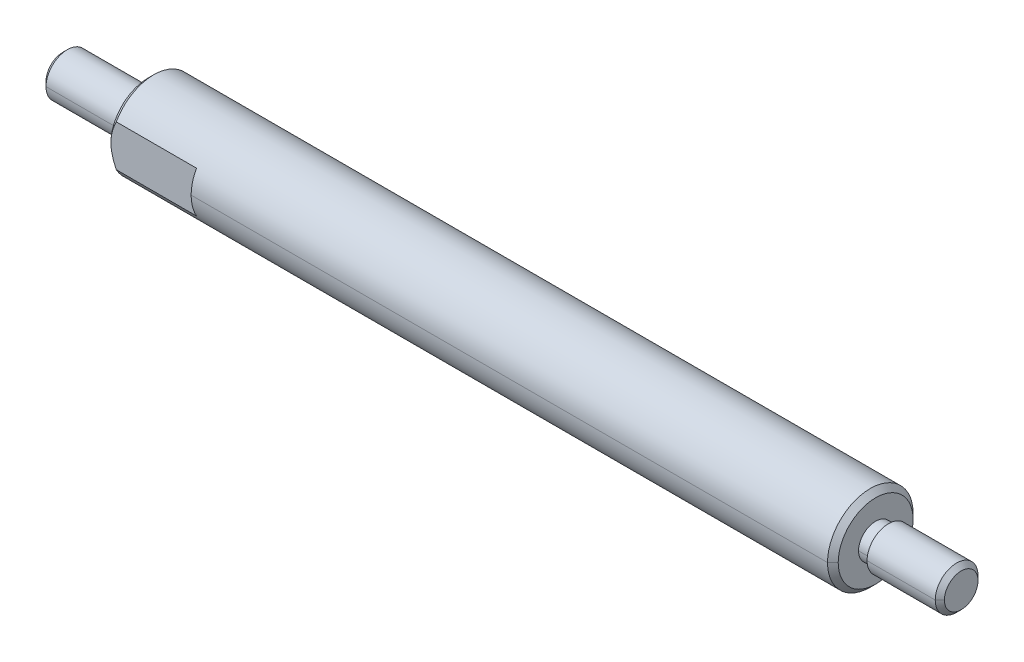
ISO-10303-21;
HEADER;
FILE_DESCRIPTION(('STEP AP214'),'2;1');
FILE_NAME('part.step','',(''),(''),'','','');
FILE_SCHEMA(('AUTOMOTIVE_DESIGN { 1 0 10303 214 1 1 1 1 }'));
ENDSEC;
DATA;
#1=APPLICATION_CONTEXT('core data for automotive mechanical design processes');
#2=APPLICATION_PROTOCOL_DEFINITION('international standard','automotive_design',2000,#1);
#3=PRODUCT_CONTEXT('',#1,'mechanical');
#4=PRODUCT('Part','Part','',(#3));
#5=PRODUCT_RELATED_PRODUCT_CATEGORY('part','',(#4));
#6=PRODUCT_DEFINITION_FORMATION('','',#4);
#7=PRODUCT_DEFINITION_CONTEXT('part definition',#1,'design');
#8=PRODUCT_DEFINITION('design','',#6,#7);
#9=PRODUCT_DEFINITION_SHAPE('','',#8);
#10=(LENGTH_UNIT() NAMED_UNIT(*) SI_UNIT(.MILLI.,.METRE.));
#11=(NAMED_UNIT(*) PLANE_ANGLE_UNIT() SI_UNIT($,.RADIAN.));
#12=(NAMED_UNIT(*) SI_UNIT($,.STERADIAN.) SOLID_ANGLE_UNIT());
#13=UNCERTAINTY_MEASURE_WITH_UNIT(LENGTH_MEASURE(1.E-05),#10,'distance_accuracy_value','');
#14=(GEOMETRIC_REPRESENTATION_CONTEXT(3) GLOBAL_UNCERTAINTY_ASSIGNED_CONTEXT((#13)) GLOBAL_UNIT_ASSIGNED_CONTEXT((#10,
#11,#12)) REPRESENTATION_CONTEXT('',''));
#15=CARTESIAN_POINT('',(0.,0.,0.));
#16=DIRECTION('',(0.,0.,1.));
#17=DIRECTION('',(1.,0.,0.));
#18=AXIS2_PLACEMENT_3D('',#15,#16,#17);
#19=CARTESIAN_POINT('',(0.,0.,0.));
#20=DIRECTION('',(1.,0.,0.));
#21=DIRECTION('',(0.,1.,0.));
#22=AXIS2_PLACEMENT_3D('',#19,#20,#21);
#23=CONICAL_SURFACE('',#22,3.5,0.785398163397448);
#24=CARTESIAN_POINT('',(0.5,0.,0.));
#25=DIRECTION('',(1.,0.,0.));
#26=DIRECTION('',(0.,0.,-1.));
#27=AXIS2_PLACEMENT_3D('',#24,#25,#26);
#28=CIRCLE('',#27,4.);
#29=CARTESIAN_POINT('',(0.5,-1.93649167310371,3.5));
#30=VERTEX_POINT('',#29);
#31=CARTESIAN_POINT('',(0.5,-1.93649167310371,-3.5));
#32=VERTEX_POINT('',#31);
#33=EDGE_CURVE('E11',#30,#32,#28,.T.);
#34=ORIENTED_EDGE('',*,*,#33,.F.);
#35=CARTESIAN_POINT('',(0.500000000000001,-1.93649167310371,3.5));
#36=CARTESIAN_POINT('',(0.481729894212885,-1.89874822282279,3.50000263641592));
#37=CARTESIAN_POINT('',(0.463809391218073,-1.86083494279448,3.50003144984892));
#38=CARTESIAN_POINT('',(0.428586511491032,-1.78442732561673,3.50010970070772));
#39=CARTESIAN_POINT('',(0.411288837618172,-1.74593082118933,3.50015926925334));
#40=CARTESIAN_POINT('',(0.377404980850407,-1.66846064543187,3.50024659944888));
#41=CARTESIAN_POINT('',(0.3608215799416,-1.62948575606787,3.50028431800336));
#42=CARTESIAN_POINT('',(0.328462664813169,-1.55115235623506,3.50033232603049));
#43=CARTESIAN_POINT('',(0.312688042674488,-1.51179347683754,3.50034258582854));
#44=CARTESIAN_POINT('',(0.282042244040601,-1.4327756106038,3.50033174018014));
#45=CARTESIAN_POINT('',(0.267170078584431,-1.3931170078691,3.5003106697376));
#46=CARTESIAN_POINT('',(0.238425065228237,-1.3135718201573,3.50024602692636));
#47=CARTESIAN_POINT('',(0.224549380422823,-1.27368626217215,3.50020252157718));
#48=CARTESIAN_POINT('',(0.197892794870912,-1.19374729444133,3.50011315115411));
#49=CARTESIAN_POINT('',(0.185107299963627,-1.15369541993336,3.50006729743444));
#50=CARTESIAN_POINT('',(0.16072263153736,-1.0734537181225,3.5000058547852));
#51=CARTESIAN_POINT('',(0.149117749799592,-1.03326563123095,3.49999011296507));
#52=CARTESIAN_POINT('',(0.127119094234048,-0.952520739957388,3.50002953689601));
#53=CARTESIAN_POINT('',(0.116726397725898,-0.911963641606916,3.50008476520527));
#54=CARTESIAN_POINT('',(0.0971615752584517,-0.830472191873705,3.50020787581652));
#55=CARTESIAN_POINT('',(0.087991876181674,-0.789537257807542,3.5002757826553));
#56=CARTESIAN_POINT('',(0.0709257689616744,-0.707371736995964,3.50039313623367));
#57=CARTESIAN_POINT('',(0.0630302803268335,-0.666140958972079,3.50044256967586));
#58=CARTESIAN_POINT('',(0.0485626549048874,-0.58345768936206,3.50050431589652));
#59=CARTESIAN_POINT('',(0.0419902001700179,-0.542005253508157,3.50051663760354));
#60=CARTESIAN_POINT('',(0.0302190934883362,-0.458943722261909,3.50050082008597));
#61=CARTESIAN_POINT('',(0.0250191980873555,-0.417334803541163,3.50047271763308));
#62=CARTESIAN_POINT('',(0.016043137784126,-0.334016964924032,3.50038646819118));
#63=CARTESIAN_POINT('',(0.0122651640142564,-0.292308240471382,3.50032835959872));
#64=CARTESIAN_POINT('',(0.00618267094413711,-0.208838599859571,3.50020461032438));
#65=CARTESIAN_POINT('',(0.0038761918883057,-0.167077827646641,3.50013897979839));
#66=CARTESIAN_POINT('',(0.000785517580601297,-0.0835453867620833,3.50003770804549));
#67=CARTESIAN_POINT('',(-3.16829512312464E-07,-0.0417737784206981,3.50000203455032));
#68=CARTESIAN_POINT('',(0.,0.,3.5));
#69=B_SPLINE_CURVE_WITH_KNOTS('',3,(#35,#36,#37,#38,#39,#40,#41,#42,#43,#44,#45,#46,#47,#48,#49,
#50,#51,#52,#53,#54,#55,#56,#57,#58,#59,#60,#61,#62,#63,#64,#65,#66,#67,#68),.UNSPECIFIED.,.F.,
.F.,(4,2,2,2,2,2,2,2,2,2,2,2,2,2,2,2,4),(0.,0.125797578323402,0.252402164550876,
0.379461988243441,0.506659069743281,0.633714146233809,0.760391852670917,0.886506215657117,
1.01197852628416,1.13756151314057,1.26339010892735,1.38930910425219,1.51519780285922,
1.64097205956828,1.76658577002032,1.89203183534899,2.01734260230366),.UNSPECIFIED.);
#70=CARTESIAN_POINT('',(0.,0.,3.5));
#71=VERTEX_POINT('',#70);
#72=EDGE_CURVE('E25',#30,#71,#69,.T.);
#73=ORIENTED_EDGE('',*,*,#72,.T.);
#74=CARTESIAN_POINT('',(0.,0.,0.));
#75=DIRECTION('',(1.,0.,0.));
#76=DIRECTION('',(0.,0.,-1.));
#77=AXIS2_PLACEMENT_3D('',#74,#75,#76);
#78=CIRCLE('',#77,3.5);
#79=CARTESIAN_POINT('',(0.,0.,-3.5));
#80=VERTEX_POINT('',#79);
#81=EDGE_CURVE('E502',#71,#80,#78,.T.);
#82=ORIENTED_EDGE('',*,*,#81,.T.);
#83=CARTESIAN_POINT('',(0.,0.,-3.5));
#84=CARTESIAN_POINT('',(-3.16829512398149E-07,-0.041773778420689,-3.50000203455032));
#85=CARTESIAN_POINT('',(0.00078551758060121,-0.0835453867620763,-3.5000377080455));
#86=CARTESIAN_POINT('',(0.00387619188830569,-0.167077827646636,-3.5001389797984));
#87=CARTESIAN_POINT('',(0.00618267094413709,-0.208838599859566,-3.50020461032438));
#88=CARTESIAN_POINT('',(0.0122651640142564,-0.292308240471378,-3.50032835959872));
#89=CARTESIAN_POINT('',(0.016043137784126,-0.334016964924027,-3.50038646819118));
#90=CARTESIAN_POINT('',(0.0250191980873555,-0.417334803541158,-3.50047271763308));
#91=CARTESIAN_POINT('',(0.0302190934883362,-0.458943722261905,-3.50050082008597));
#92=CARTESIAN_POINT('',(0.0419902001700178,-0.542005253508155,-3.50051663760354));
#93=CARTESIAN_POINT('',(0.0485626549048872,-0.583457689362059,-3.50050431589652));
#94=CARTESIAN_POINT('',(0.0630302803268333,-0.666140958972079,-3.50044256967586));
#95=CARTESIAN_POINT('',(0.0709257689616743,-0.707371736995963,-3.50039313623367));
#96=CARTESIAN_POINT('',(0.0879918761816741,-0.789537257807541,-3.5002757826553));
#97=CARTESIAN_POINT('',(0.0971615752584519,-0.830472191873704,-3.50020787581652));
#98=CARTESIAN_POINT('',(0.116726397725898,-0.911963641606916,-3.50008476520527));
#99=CARTESIAN_POINT('',(0.127119094234048,-0.952520739957389,-3.50002953689601));
#100=CARTESIAN_POINT('',(0.149117749799592,-1.03326563123096,-3.49999011296506));
#101=CARTESIAN_POINT('',(0.160722631537359,-1.07345371812251,-3.5000058547852));
#102=CARTESIAN_POINT('',(0.185107299963627,-1.15369541993336,-3.50006729743444));
#103=CARTESIAN_POINT('',(0.197892794870912,-1.19374729444133,-3.50011315115411));
#104=CARTESIAN_POINT('',(0.224549380422823,-1.27368626217215,-3.50020252157718));
#105=CARTESIAN_POINT('',(0.238425065228237,-1.3135718201573,-3.50024602692636));
#106=CARTESIAN_POINT('',(0.26717007858443,-1.3931170078691,-3.5003106697376));
#107=CARTESIAN_POINT('',(0.282042244040601,-1.4327756106038,-3.50033174018014));
#108=CARTESIAN_POINT('',(0.312688042674488,-1.51179347683754,-3.50034258582854));
#109=CARTESIAN_POINT('',(0.328462664813168,-1.55115235623507,-3.50033232603049));
#110=CARTESIAN_POINT('',(0.3608215799416,-1.62948575606788,-3.50028431800336));
#111=CARTESIAN_POINT('',(0.377404980850406,-1.66846064543188,-3.50024659944888));
#112=CARTESIAN_POINT('',(0.411288837618171,-1.74593082118933,-3.50015926925334));
#113=CARTESIAN_POINT('',(0.428586511491031,-1.78442732561673,-3.50010970070772));
#114=CARTESIAN_POINT('',(0.463809391218072,-1.86083494279448,-3.50003144984892));
#115=CARTESIAN_POINT('',(0.481729894212885,-1.89874822282279,-3.50000263641592));
#116=CARTESIAN_POINT('',(0.5,-1.93649167310371,-3.5));
#117=B_SPLINE_CURVE_WITH_KNOTS('',3,(#83,#84,#85,#86,#87,#88,#89,#90,#91,#92,#93,#94,#95,#96,
#97,#98,#99,#100,#101,#102,#103,#104,#105,#106,#107,#108,#109,#110,#111,#112,#113,#114,#115,
#116),.UNSPECIFIED.,.F.,.F.,(4,2,2,2,2,2,2,2,2,2,2,2,2,2,2,2,4),(0.,0.125310766954671,
0.250756832283348,0.376370542735383,0.502144799444446,0.628033498051478,0.753952493376318,
0.8797810891631,1.00536407601951,1.13083638664656,1.25695074963275,1.38362845606987,
1.51068353256039,1.63788061406023,1.7649404377528,1.89154502398027,2.01734260230367),.UNSPECIFIED.);
#118=EDGE_CURVE('E492',#80,#32,#117,.T.);
#119=ORIENTED_EDGE('',*,*,#118,.T.);
#120=EDGE_LOOP('',(#34,#73,#82,#119));
#121=FACE_BOUND('',#120,.T.);
#122=ADVANCED_FACE('F16',(#121),#23,.T.);
#123=CARTESIAN_POINT('',(8.,-8.,-3.5));
#124=DIRECTION('',(0.,0.,1.));
#125=DIRECTION('',(1.,0.,0.));
#126=AXIS2_PLACEMENT_3D('',#123,#124,#125);
#127=PLANE('',#126);
#128=ORIENTED_EDGE('',*,*,#118,.F.);
#129=CARTESIAN_POINT('',(0.500000000000001,1.93649167310371,-3.5));
#130=CARTESIAN_POINT('',(0.490875249697932,1.91764327784195,-3.50000021533807));
#131=CARTESIAN_POINT('',(0.481836693213126,1.89875312507498,-3.50000547341037));
#132=CARTESIAN_POINT('',(0.463900454733611,1.86081602096756,-3.50002157401013));
#133=CARTESIAN_POINT('',(0.455003458380112,1.84176874548831,-3.5000324382043));
#134=CARTESIAN_POINT('',(0.437364302847882,1.80353532796564,-3.50005521074573));
#135=CARTESIAN_POINT('',(0.428622669981429,1.78434894306122,-3.50006712204136));
#136=CARTESIAN_POINT('',(0.41130844219508,1.74585451619488,-3.50008883201298));
#137=CARTESIAN_POINT('',(0.402736214787635,1.72654630889734,-3.50009862647471));
#138=CARTESIAN_POINT('',(0.385774935331718,1.68782480496335,-3.50011392977831));
#139=CARTESIAN_POINT('',(0.377386090428912,1.66841141756619,-3.50011943399487));
#140=CARTESIAN_POINT('',(0.360805733571367,1.62949541041907,-3.50012508023241));
#141=CARTESIAN_POINT('',(0.352614266092422,1.60999277171432,-3.50012522105592));
#142=CARTESIAN_POINT('',(0.336442816919582,1.57091338104565,-3.50012012273438));
#143=CARTESIAN_POINT('',(0.328462713973172,1.55133667927397,-3.50011488674552));
#144=CARTESIAN_POINT('',(0.312728162869376,1.51212349994854,-3.50010009189973));
#145=CARTESIAN_POINT('',(0.304973424172466,1.49248713901867,-3.50009053889776));
#146=CARTESIAN_POINT('',(0.289703731976782,1.45316818008757,-3.50006916274861));
#147=CARTESIAN_POINT('',(0.282188314961646,1.43348576217604,-3.5000573443459));
#148=CARTESIAN_POINT('',(0.267411557963523,1.39408732702519,-3.50003470283807));
#149=CARTESIAN_POINT('',(0.260149577440294,1.3743715501423,-3.50002387709109));
#150=CARTESIAN_POINT('',(0.245893404676809,1.3349183508543,-3.50000680037563));
#151=CARTESIAN_POINT('',(0.238898393504929,1.31518122457,-3.5000005341345));
#152=CARTESIAN_POINT('',(0.225174780756556,1.27564590082737,-3.49999969142382));
#153=CARTESIAN_POINT('',(0.218445815174127,1.25584782979736,-3.50000509837647));
#154=CARTESIAN_POINT('',(0.205240545078235,1.21613203270299,-3.5000259541039));
#155=CARTESIAN_POINT('',(0.198764666753273,1.19621416491386,-3.50004141910367));
#156=CARTESIAN_POINT('',(0.186073389102022,1.15626734244253,-3.50007742769901));
#157=CARTESIAN_POINT('',(0.179858336174558,1.13623827768881,-3.50009797781304));
#158=CARTESIAN_POINT('',(0.167697599963074,1.09607712199876,-3.5001410317733));
#159=CARTESIAN_POINT('',(0.161752186178359,1.07594494943509,-3.50016353751138));
#160=CARTESIAN_POINT('',(0.150139363252317,1.03558508778073,-3.50020780497892));
#161=CARTESIAN_POINT('',(0.144472154349511,1.01535734105509,-3.50022956616917));
#162=CARTESIAN_POINT('',(0.133424433756914,0.974813168238372,-3.50027042248861));
#163=CARTESIAN_POINT('',(0.128044061983838,0.954496704005716,-3.50028951632391));
#164=CARTESIAN_POINT('',(0.117578686460978,0.913781272961122,-3.50032377206706));
#165=CARTESIAN_POINT('',(0.112493772298314,0.893382283110983,-3.50033893278711));
#166=CARTESIAN_POINT('',(0.102627958452014,0.85250730037319,-3.50036468555281));
#167=CARTESIAN_POINT('',(0.097847109304972,0.832031295281214,-3.5003752768407));
#168=CARTESIAN_POINT('',(0.0885981303417215,0.791007076727367,-3.50039194007419));
#169=CARTESIAN_POINT('',(0.0841300247315237,0.770458857805206,-3.50039801167032));
#170=CARTESIAN_POINT('',(0.0755149595619078,0.72929435419023,-3.50040598531661));
#171=CARTESIAN_POINT('',(0.0713680121392101,0.708678066955748,-3.50040788720927));
#172=CARTESIAN_POINT('',(0.0634048724470851,0.667381736677047,-3.50040946017625));
#173=CARTESIAN_POINT('',(0.0595886791314459,0.646701693834709,-3.50040913125763));
#174=CARTESIAN_POINT('',(0.0522952076236296,0.605286370081193,-3.500406414557));
#175=CARTESIAN_POINT('',(0.0488178586197354,0.584551101645589,-3.50040402720619));
#176=CARTESIAN_POINT('',(0.0422069311616563,0.543034337109382,-3.50039475919438));
#177=CARTESIAN_POINT('',(0.039073215475684,0.522252862869072,-3.50038788033476));
#178=CARTESIAN_POINT('',(0.0331552081933573,0.480652002202429,-3.50036898648347));
#179=CARTESIAN_POINT('',(0.0303707229708554,0.459832643335171,-3.50035697435429));
#180=CARTESIAN_POINT('',(0.0251566001863169,0.41816387174196,-3.50032784411369));
#181=CARTESIAN_POINT('',(0.0227267229464012,0.397314489024491,-3.50031072947506));
#182=CARTESIAN_POINT('',(0.0182272952882025,0.355593025326963,-3.50027237209467));
#183=CARTESIAN_POINT('',(0.0161574700050198,0.334720974010234,-3.50025113252835));
#184=CARTESIAN_POINT('',(0.0123835708281206,0.29296104914705,-3.50020631257991));
#185=CARTESIAN_POINT('',(0.0106791985139428,0.272073202594836,-3.50018273413085));
#186=CARTESIAN_POINT('',(0.00764172620233359,0.230288087106283,-3.50013595413175));
#187=CARTESIAN_POINT('',(0.00630831644050704,0.209390840714381,-3.50011275228258));
#188=CARTESIAN_POINT('',(0.00401788904623468,0.167592875232936,-3.50006987287111));
#189=CARTESIAN_POINT('',(0.00306056362229496,0.146692173047007,-3.50005019243407));
#190=CARTESIAN_POINT('',(0.00152885609777019,0.104892763671267,-3.5000196614215));
#191=CARTESIAN_POINT('',(0.000954180702697819,0.083994067257996,-3.5000088040818));
#192=CARTESIAN_POINT('',(0.000186358423632153,0.0420636069512591,-3.4999967909775));
#193=CARTESIAN_POINT('',(-4.46698193477926E-06,0.0210318005458209,-3.49999569410731));
#194=CARTESIAN_POINT('',(0.,0.,-3.5));
#195=B_SPLINE_CURVE_WITH_KNOTS('',3,(#129,#130,#131,#132,#133,#134,#135,#136,#137,#138,#139,
#140,#141,#142,#143,#144,#145,#146,#147,#148,#149,#150,#151,#152,#153,#154,#155,#156,#157,#158,
#159,#160,#161,#162,#163,#164,#165,#166,#167,#168,#169,#170,#171,#172,#173,#174,#175,#176,#177,
#178,#179,#180,#181,#182,#183,#184,#185,#186,#187,#188,#189,#190,#191,#192,#193,#194),
.UNSPECIFIED.,.F.,.F.,(4,2,2,2,2,2,2,2,2,2,2,2,2,2,2,2,2,2,2,2,2,2,2,2,2,2,2,2,2,2,2,2,4),(0.,
0.0628226479739315,0.12588993393465,0.189140866391467,0.252516584166299,0.315960533270773,
0.379418647217314,0.442839532348226,0.506174659666208,0.569378564546006,0.632409055589583,
0.695227433744642,0.757956658454826,0.820787325784938,0.883698955003026,0.946672136642775,
1.00968999805434,1.07273832294561,1.1358056663178,1.19888346444212,1.26196613933325,
1.3250511969865,1.38813605508745,1.45120770130703,1.51425406708742,1.57726532166237,
1.64023378799151,1.7031539709805,1.76602257746556,1.8288385282014,1.89160296204646,
1.95431923251298,2.01741367656724),.UNSPECIFIED.);
#196=CARTESIAN_POINT('',(0.5,1.93649167310371,-3.5));
#197=VERTEX_POINT('',#196);
#198=EDGE_CURVE('E252',#197,#80,#195,.T.);
#199=ORIENTED_EDGE('',*,*,#198,.F.);
#200=DIRECTION('',(-1.,0.,0.));
#201=VECTOR('',#200,1.);
#202=CARTESIAN_POINT('',(68.,1.93649167310371,-3.5));
#203=LINE('',#202,#201);
#204=CARTESIAN_POINT('',(8.,1.93649167310371,-3.5));
#205=VERTEX_POINT('',#204);
#206=EDGE_CURVE('E457',#205,#197,#203,.T.);
#207=ORIENTED_EDGE('',*,*,#206,.F.);
#208=DIRECTION('',(0.,1.,0.));
#209=VECTOR('',#208,1.);
#210=CARTESIAN_POINT('',(8.,-8.,-3.5));
#211=LINE('',#210,#209);
#212=CARTESIAN_POINT('',(8.,-1.93649167310371,-3.5));
#213=VERTEX_POINT('',#212);
#214=EDGE_CURVE('E452',#213,#205,#211,.T.);
#215=ORIENTED_EDGE('',*,*,#214,.F.);
#216=DIRECTION('',(1.,0.,0.));
#217=VECTOR('',#216,1.);
#218=CARTESIAN_POINT('',(68.,-1.93649167310371,-3.5));
#219=LINE('',#218,#217);
#220=EDGE_CURVE('E447',#32,#213,#219,.T.);
#221=ORIENTED_EDGE('',*,*,#220,.F.);
#222=EDGE_LOOP('',(#128,#199,#207,#215,#221));
#223=FACE_BOUND('',#222,.T.);
#224=ADVANCED_FACE('F468',(#223),#127,.F.);
#225=CARTESIAN_POINT('',(68.,0.,0.));
#226=DIRECTION('',(1.,0.,0.));
#227=DIRECTION('',(0.,1.,-5.8935951136395E-10));
#228=AXIS2_PLACEMENT_3D('',#225,#226,#227);
#229=CYLINDRICAL_SURFACE('',#228,4.);
#230=DIRECTION('',(1.,0.,0.));
#231=VECTOR('',#230,1.);
#232=CARTESIAN_POINT('',(8.,0.,4.));
#233=LINE('',#232,#231);
#234=CARTESIAN_POINT('',(8.,0.,4.));
#235=VERTEX_POINT('',#234);
#236=CARTESIAN_POINT('',(67.5,0.,4.));
#237=VERTEX_POINT('',#236);
#238=EDGE_CURVE('E442',#235,#237,#233,.T.);
#239=ORIENTED_EDGE('',*,*,#238,.F.);
#240=CARTESIAN_POINT('',(8.,0.,0.));
#241=DIRECTION('',(1.,0.,0.));
#242=DIRECTION('',(0.,0.,-1.));
#243=AXIS2_PLACEMENT_3D('',#240,#241,#242);
#244=CIRCLE('',#243,4.);
#245=CARTESIAN_POINT('',(8.,-1.93649167310371,3.5));
#246=VERTEX_POINT('',#245);
#247=EDGE_CURVE('E438',#235,#246,#244,.T.);
#248=ORIENTED_EDGE('',*,*,#247,.T.);
#249=DIRECTION('',(-1.,0.,0.));
#250=VECTOR('',#249,1.);
#251=CARTESIAN_POINT('',(68.,-1.93649167310371,3.5));
#252=LINE('',#251,#250);
#253=EDGE_CURVE('E433',#246,#30,#252,.T.);
#254=ORIENTED_EDGE('',*,*,#253,.T.);
#255=ORIENTED_EDGE('',*,*,#33,.T.);
#256=ORIENTED_EDGE('',*,*,#220,.T.);
#257=CARTESIAN_POINT('',(8.,0.,0.));
#258=DIRECTION('',(1.,0.,0.));
#259=DIRECTION('',(0.,0.,-1.));
#260=AXIS2_PLACEMENT_3D('',#257,#258,#259);
#261=CIRCLE('',#260,4.);
#262=CARTESIAN_POINT('',(8.,0.,-4.));
#263=VERTEX_POINT('',#262);
#264=EDGE_CURVE('E429',#213,#263,#261,.T.);
#265=ORIENTED_EDGE('',*,*,#264,.T.);
#266=DIRECTION('',(1.,0.,0.));
#267=VECTOR('',#266,1.);
#268=CARTESIAN_POINT('',(8.,0.,-4.));
#269=LINE('',#268,#267);
#270=CARTESIAN_POINT('',(67.5,0.,-4.));
#271=VERTEX_POINT('',#270);
#272=EDGE_CURVE('E425',#263,#271,#269,.T.);
#273=ORIENTED_EDGE('',*,*,#272,.T.);
#274=CARTESIAN_POINT('',(67.5,0.,0.));
#275=DIRECTION('',(1.,0.,0.));
#276=DIRECTION('',(0.,0.,-1.));
#277=AXIS2_PLACEMENT_3D('',#274,#275,#276);
#278=CIRCLE('',#277,4.);
#279=EDGE_CURVE('E420',#237,#271,#278,.T.);
#280=ORIENTED_EDGE('',*,*,#279,.F.);
#281=EDGE_LOOP('',(#239,#248,#254,#255,#256,#265,#273,#280));
#282=FACE_BOUND('',#281,.T.);
#283=ADVANCED_FACE('F477',(#282),#229,.T.);
#284=CARTESIAN_POINT('',(67.5,0.,0.));
#285=DIRECTION('',(-1.,0.,0.));
#286=DIRECTION('',(0.,1.,0.));
#287=AXIS2_PLACEMENT_3D('',#284,#285,#286);
#288=CONICAL_SURFACE('',#287,4.,0.785398163397448);
#289=DIRECTION('',(-0.707106781186548,0.,-0.707106781186547));
#290=VECTOR('',#289,1.);
#291=CARTESIAN_POINT('',(68.,0.,-3.5));
#292=LINE('',#291,#290);
#293=CARTESIAN_POINT('',(68.,0.,-3.5));
#294=VERTEX_POINT('',#293);
#295=EDGE_CURVE('E415',#294,#271,#292,.T.);
#296=ORIENTED_EDGE('',*,*,#295,.F.);
#297=CARTESIAN_POINT('',(68.,0.,0.));
#298=DIRECTION('',(1.,0.,0.));
#299=DIRECTION('',(0.,0.,-1.));
#300=AXIS2_PLACEMENT_3D('',#297,#298,#299);
#301=CIRCLE('',#300,3.5);
#302=CARTESIAN_POINT('',(68.,0.,3.5));
#303=VERTEX_POINT('',#302);
#304=EDGE_CURVE('E410',#303,#294,#301,.T.);
#305=ORIENTED_EDGE('',*,*,#304,.F.);
#306=DIRECTION('',(-0.707106781186548,0.,0.707106781186547));
#307=VECTOR('',#306,1.);
#308=CARTESIAN_POINT('',(68.,0.,3.5));
#309=LINE('',#308,#307);
#310=EDGE_CURVE('E405',#303,#237,#309,.T.);
#311=ORIENTED_EDGE('',*,*,#310,.T.);
#312=ORIENTED_EDGE('',*,*,#279,.T.);
#313=EDGE_LOOP('',(#296,#305,#311,#312));
#314=FACE_BOUND('',#313,.T.);
#315=ADVANCED_FACE('F533',(#314),#288,.T.);
#316=CARTESIAN_POINT('',(67.5,0.,0.));
#317=DIRECTION('',(-1.,0.,0.));
#318=DIRECTION('',(0.,-1.,0.));
#319=AXIS2_PLACEMENT_3D('',#316,#317,#318);
#320=CONICAL_SURFACE('',#319,4.,0.785398163397448);
#321=ORIENTED_EDGE('',*,*,#295,.T.);
#322=CARTESIAN_POINT('',(67.5,0.,0.));
#323=DIRECTION('',(1.,0.,0.));
#324=DIRECTION('',(0.,0.,-1.));
#325=AXIS2_PLACEMENT_3D('',#322,#323,#324);
#326=CIRCLE('',#325,4.);
#327=EDGE_CURVE('E400',#271,#237,#326,.T.);
#328=ORIENTED_EDGE('',*,*,#327,.T.);
#329=ORIENTED_EDGE('',*,*,#310,.F.);
#330=CARTESIAN_POINT('',(68.,0.,0.));
#331=DIRECTION('',(1.,0.,0.));
#332=DIRECTION('',(0.,0.,-1.));
#333=AXIS2_PLACEMENT_3D('',#330,#331,#332);
#334=CIRCLE('',#333,3.5);
#335=EDGE_CURVE('E395',#294,#303,#334,.T.);
#336=ORIENTED_EDGE('',*,*,#335,.F.);
#337=EDGE_LOOP('',(#321,#328,#329,#336));
#338=FACE_BOUND('',#337,.T.);
#339=ADVANCED_FACE('F540',(#338),#320,.T.);
#340=CARTESIAN_POINT('',(68.,3.5,0.));
#341=DIRECTION('',(-1.,0.,0.));
#342=DIRECTION('',(0.,0.,1.));
#343=AXIS2_PLACEMENT_3D('',#340,#341,#342);
#344=PLANE('',#343);
#345=CARTESIAN_POINT('',(68.,0.,0.));
#346=DIRECTION('',(1.,0.,0.));
#347=DIRECTION('',(0.,0.,-1.));
#348=AXIS2_PLACEMENT_3D('',#345,#346,#347);
#349=CIRCLE('',#348,1.6);
#350=CARTESIAN_POINT('',(68.,0.,1.6));
#351=VERTEX_POINT('',#350);
#352=CARTESIAN_POINT('',(68.,0.,-1.6));
#353=VERTEX_POINT('',#352);
#354=EDGE_CURVE('E390',#351,#353,#349,.T.);
#355=ORIENTED_EDGE('',*,*,#354,.F.);
#356=CARTESIAN_POINT('',(68.,0.,0.));
#357=DIRECTION('',(1.,0.,0.));
#358=DIRECTION('',(0.,0.,-1.));
#359=AXIS2_PLACEMENT_3D('',#356,#357,#358);
#360=CIRCLE('',#359,1.6);
#361=EDGE_CURVE('E385',#353,#351,#360,.T.);
#362=ORIENTED_EDGE('',*,*,#361,.F.);
#363=EDGE_LOOP('',(#355,#362));
#364=FACE_BOUND('',#363,.T.);
#365=ORIENTED_EDGE('',*,*,#335,.T.);
#366=ORIENTED_EDGE('',*,*,#304,.T.);
#367=EDGE_LOOP('',(#365,#366));
#368=FACE_BOUND('',#367,.T.);
#369=ADVANCED_FACE('F547',(#364,#368),#344,.F.);
#370=CARTESIAN_POINT('',(76.,0.,0.));
#371=DIRECTION('',(1.,0.,0.));
#372=DIRECTION('',(0.,-1.,0.));
#373=AXIS2_PLACEMENT_3D('',#370,#371,#372);
#374=CYLINDRICAL_SURFACE('',#373,1.6);
#375=DIRECTION('',(1.,0.,0.));
#376=VECTOR('',#375,1.);
#377=CARTESIAN_POINT('',(68.,0.,1.6));
#378=LINE('',#377,#376);
#379=CARTESIAN_POINT('',(69.2,0.,1.6));
#380=VERTEX_POINT('',#379);
#381=EDGE_CURVE('E381',#351,#380,#378,.T.);
#382=ORIENTED_EDGE('',*,*,#381,.T.);
#383=CARTESIAN_POINT('',(69.2,0.,0.));
#384=DIRECTION('',(1.,0.,0.));
#385=DIRECTION('',(0.,0.,-1.));
#386=AXIS2_PLACEMENT_3D('',#383,#384,#385);
#387=CIRCLE('',#386,1.6);
#388=CARTESIAN_POINT('',(69.2,0.,-1.6));
#389=VERTEX_POINT('',#388);
#390=EDGE_CURVE('E376',#389,#380,#387,.T.);
#391=ORIENTED_EDGE('',*,*,#390,.F.);
#392=DIRECTION('',(1.,0.,0.));
#393=VECTOR('',#392,1.);
#394=CARTESIAN_POINT('',(68.,0.,-1.6));
#395=LINE('',#394,#393);
#396=EDGE_CURVE('E371',#353,#389,#395,.T.);
#397=ORIENTED_EDGE('',*,*,#396,.F.);
#398=ORIENTED_EDGE('',*,*,#361,.T.);
#399=EDGE_LOOP('',(#382,#391,#397,#398));
#400=FACE_BOUND('',#399,.T.);
#401=ADVANCED_FACE('F555',(#400),#374,.T.);
#402=CARTESIAN_POINT('',(76.,0.,0.));
#403=DIRECTION('',(1.,0.,0.));
#404=DIRECTION('',(0.,1.,0.));
#405=AXIS2_PLACEMENT_3D('',#402,#403,#404);
#406=CYLINDRICAL_SURFACE('',#405,1.6);
#407=ORIENTED_EDGE('',*,*,#381,.F.);
#408=ORIENTED_EDGE('',*,*,#354,.T.);
#409=ORIENTED_EDGE('',*,*,#396,.T.);
#410=CARTESIAN_POINT('',(69.2,0.,0.));
#411=DIRECTION('',(1.,0.,0.));
#412=DIRECTION('',(0.,0.,-1.));
#413=AXIS2_PLACEMENT_3D('',#410,#411,#412);
#414=CIRCLE('',#413,1.6);
#415=EDGE_CURVE('E366',#380,#389,#414,.T.);
#416=ORIENTED_EDGE('',*,*,#415,.F.);
#417=EDGE_LOOP('',(#407,#408,#409,#416));
#418=FACE_BOUND('',#417,.T.);
#419=ADVANCED_FACE('F563',(#418),#406,.T.);
#420=CARTESIAN_POINT('',(69.2,1.6,0.));
#421=DIRECTION('',(1.,0.,0.));
#422=DIRECTION('',(0.,0.,-1.));
#423=AXIS2_PLACEMENT_3D('',#420,#421,#422);
#424=PLANE('',#423);
#425=CARTESIAN_POINT('',(69.2,0.,0.));
#426=DIRECTION('',(1.,0.,0.));
#427=DIRECTION('',(0.,0.,-1.));
#428=AXIS2_PLACEMENT_3D('',#425,#426,#427);
#429=CIRCLE('',#428,2.);
#430=CARTESIAN_POINT('',(69.2,0.,2.));
#431=VERTEX_POINT('',#430);
#432=CARTESIAN_POINT('',(69.2,0.,-2.));
#433=VERTEX_POINT('',#432);
#434=EDGE_CURVE('E361',#431,#433,#429,.T.);
#435=ORIENTED_EDGE('',*,*,#434,.F.);
#436=CARTESIAN_POINT('',(69.2,0.,0.));
#437=DIRECTION('',(1.,0.,0.));
#438=DIRECTION('',(0.,0.,-1.));
#439=AXIS2_PLACEMENT_3D('',#436,#437,#438);
#440=CIRCLE('',#439,2.);
#441=EDGE_CURVE('E356',#433,#431,#440,.T.);
#442=ORIENTED_EDGE('',*,*,#441,.F.);
#443=EDGE_LOOP('',(#435,#442));
#444=FACE_BOUND('',#443,.T.);
#445=ORIENTED_EDGE('',*,*,#390,.T.);
#446=ORIENTED_EDGE('',*,*,#415,.T.);
#447=EDGE_LOOP('',(#445,#446));
#448=FACE_BOUND('',#447,.T.);
#449=ADVANCED_FACE('F571',(#444,#448),#424,.F.);
#450=CARTESIAN_POINT('',(76.,0.,0.));
#451=DIRECTION('',(1.,0.,0.));
#452=DIRECTION('',(0.,-1.,0.));
#453=AXIS2_PLACEMENT_3D('',#450,#451,#452);
#454=CYLINDRICAL_SURFACE('',#453,2.);
#455=DIRECTION('',(1.,0.,0.));
#456=VECTOR('',#455,1.);
#457=CARTESIAN_POINT('',(69.2,0.,2.));
#458=LINE('',#457,#456);
#459=CARTESIAN_POINT('',(75.5705,0.,2.));
#460=VERTEX_POINT('',#459);
#461=EDGE_CURVE('E352',#431,#460,#458,.T.);
#462=ORIENTED_EDGE('',*,*,#461,.T.);
#463=CARTESIAN_POINT('',(75.5705,0.,0.));
#464=DIRECTION('',(1.,0.,0.));
#465=DIRECTION('',(0.,0.,-1.));
#466=AXIS2_PLACEMENT_3D('',#463,#464,#465);
#467=CIRCLE('',#466,2.);
#468=CARTESIAN_POINT('',(75.5705,0.,-2.));
#469=VERTEX_POINT('',#468);
#470=EDGE_CURVE('E347',#469,#460,#467,.T.);
#471=ORIENTED_EDGE('',*,*,#470,.F.);
#472=DIRECTION('',(1.,0.,0.));
#473=VECTOR('',#472,1.);
#474=CARTESIAN_POINT('',(69.2,0.,-2.));
#475=LINE('',#474,#473);
#476=EDGE_CURVE('E342',#433,#469,#475,.T.);
#477=ORIENTED_EDGE('',*,*,#476,.F.);
#478=ORIENTED_EDGE('',*,*,#441,.T.);
#479=EDGE_LOOP('',(#462,#471,#477,#478));
#480=FACE_BOUND('',#479,.T.);
#481=ADVANCED_FACE('F579',(#480),#454,.T.);
#482=CARTESIAN_POINT('',(76.,0.,0.));
#483=DIRECTION('',(1.,0.,0.));
#484=DIRECTION('',(0.,1.,0.));
#485=AXIS2_PLACEMENT_3D('',#482,#483,#484);
#486=CYLINDRICAL_SURFACE('',#485,2.);
#487=ORIENTED_EDGE('',*,*,#461,.F.);
#488=ORIENTED_EDGE('',*,*,#434,.T.);
#489=ORIENTED_EDGE('',*,*,#476,.T.);
#490=CARTESIAN_POINT('',(75.5705,0.,0.));
#491=DIRECTION('',(1.,0.,0.));
#492=DIRECTION('',(0.,0.,-1.));
#493=AXIS2_PLACEMENT_3D('',#490,#491,#492);
#494=CIRCLE('',#493,2.);
#495=EDGE_CURVE('E337',#460,#469,#494,.T.);
#496=ORIENTED_EDGE('',*,*,#495,.F.);
#497=EDGE_LOOP('',(#487,#488,#489,#496));
#498=FACE_BOUND('',#497,.T.);
#499=ADVANCED_FACE('F587',(#498),#486,.T.);
#500=CARTESIAN_POINT('',(75.5705,0.,0.));
#501=DIRECTION('',(-1.,0.,0.));
#502=DIRECTION('',(0.,1.,0.));
#503=AXIS2_PLACEMENT_3D('',#500,#501,#502);
#504=CONICAL_SURFACE('',#503,2.,0.785398163397449);
#505=DIRECTION('',(-0.707106781186549,0.,-0.707106781186546));
#506=VECTOR('',#505,1.);
#507=CARTESIAN_POINT('',(76.,0.,-1.5705));
#508=LINE('',#507,#506);
#509=CARTESIAN_POINT('',(76.,0.,-1.5705));
#510=VERTEX_POINT('',#509);
#511=EDGE_CURVE('E332',#510,#469,#508,.T.);
#512=ORIENTED_EDGE('',*,*,#511,.F.);
#513=CARTESIAN_POINT('',(76.,0.,0.));
#514=DIRECTION('',(1.,0.,0.));
#515=DIRECTION('',(0.,0.,-1.));
#516=AXIS2_PLACEMENT_3D('',#513,#514,#515);
#517=CIRCLE('',#516,1.5705);
#518=CARTESIAN_POINT('',(76.,0.,1.5705));
#519=VERTEX_POINT('',#518);
#520=EDGE_CURVE('E327',#519,#510,#517,.T.);
#521=ORIENTED_EDGE('',*,*,#520,.F.);
#522=DIRECTION('',(-0.707106781186549,0.,0.707106781186546));
#523=VECTOR('',#522,1.);
#524=CARTESIAN_POINT('',(76.,0.,1.5705));
#525=LINE('',#524,#523);
#526=EDGE_CURVE('E322',#519,#460,#525,.T.);
#527=ORIENTED_EDGE('',*,*,#526,.T.);
#528=ORIENTED_EDGE('',*,*,#495,.T.);
#529=EDGE_LOOP('',(#512,#521,#527,#528));
#530=FACE_BOUND('',#529,.T.);
#531=ADVANCED_FACE('F595',(#530),#504,.T.);
#532=CARTESIAN_POINT('',(75.5705,0.,0.));
#533=DIRECTION('',(-1.,0.,0.));
#534=DIRECTION('',(0.,-1.,0.));
#535=AXIS2_PLACEMENT_3D('',#532,#533,#534);
#536=CONICAL_SURFACE('',#535,2.,0.785398163397449);
#537=ORIENTED_EDGE('',*,*,#511,.T.);
#538=ORIENTED_EDGE('',*,*,#470,.T.);
#539=ORIENTED_EDGE('',*,*,#526,.F.);
#540=CARTESIAN_POINT('',(76.,0.,0.));
#541=DIRECTION('',(1.,0.,0.));
#542=DIRECTION('',(0.,0.,-1.));
#543=AXIS2_PLACEMENT_3D('',#540,#541,#542);
#544=CIRCLE('',#543,1.5705);
#545=EDGE_CURVE('E317',#510,#519,#544,.T.);
#546=ORIENTED_EDGE('',*,*,#545,.F.);
#547=EDGE_LOOP('',(#537,#538,#539,#546));
#548=FACE_BOUND('',#547,.T.);
#549=ADVANCED_FACE('F603',(#548),#536,.T.);
#550=CARTESIAN_POINT('',(76.,1.5705,0.));
#551=DIRECTION('',(-1.,0.,0.));
#552=DIRECTION('',(0.,0.,1.));
#553=AXIS2_PLACEMENT_3D('',#550,#551,#552);
#554=PLANE('',#553);
#555=ORIENTED_EDGE('',*,*,#545,.T.);
#556=ORIENTED_EDGE('',*,*,#520,.T.);
#557=EDGE_LOOP('',(#555,#556));
#558=FACE_BOUND('',#557,.T.);
#559=ADVANCED_FACE('F611',(#558),#554,.F.);
#560=CARTESIAN_POINT('',(68.,0.,0.));
#561=DIRECTION('',(1.,0.,0.));
#562=DIRECTION('',(0.,-1.,0.));
#563=AXIS2_PLACEMENT_3D('',#560,#561,#562);
#564=CYLINDRICAL_SURFACE('',#563,4.);
#565=ORIENTED_EDGE('',*,*,#238,.T.);
#566=ORIENTED_EDGE('',*,*,#327,.F.);
#567=ORIENTED_EDGE('',*,*,#272,.F.);
#568=CARTESIAN_POINT('',(8.,0.,0.));
#569=DIRECTION('',(1.,0.,0.));
#570=DIRECTION('',(0.,0.,-1.));
#571=AXIS2_PLACEMENT_3D('',#568,#569,#570);
#572=CIRCLE('',#571,4.);
#573=EDGE_CURVE('E312',#263,#205,#572,.T.);
#574=ORIENTED_EDGE('',*,*,#573,.T.);
#575=ORIENTED_EDGE('',*,*,#206,.T.);
#576=CARTESIAN_POINT('',(0.5,0.,0.));
#577=DIRECTION('',(1.,0.,0.));
#578=DIRECTION('',(0.,0.,-1.));
#579=AXIS2_PLACEMENT_3D('',#576,#577,#578);
#580=CIRCLE('',#579,4.);
#581=CARTESIAN_POINT('',(0.5,1.93649167310371,3.5));
#582=VERTEX_POINT('',#581);
#583=EDGE_CURVE('E308',#197,#582,#580,.T.);
#584=ORIENTED_EDGE('',*,*,#583,.T.);
#585=DIRECTION('',(1.,0.,0.));
#586=VECTOR('',#585,1.);
#587=CARTESIAN_POINT('',(68.,1.93649167310371,3.5));
#588=LINE('',#587,#586);
#589=CARTESIAN_POINT('',(8.,1.93649167310371,3.5));
#590=VERTEX_POINT('',#589);
#591=EDGE_CURVE('E304',#582,#590,#588,.T.);
#592=ORIENTED_EDGE('',*,*,#591,.T.);
#593=CARTESIAN_POINT('',(8.,0.,0.));
#594=DIRECTION('',(1.,0.,0.));
#595=DIRECTION('',(0.,0.,-1.));
#596=AXIS2_PLACEMENT_3D('',#593,#594,#595);
#597=CIRCLE('',#596,4.);
#598=EDGE_CURVE('E299',#590,#235,#597,.T.);
#599=ORIENTED_EDGE('',*,*,#598,.T.);
#600=EDGE_LOOP('',(#565,#566,#567,#574,#575,#584,#592,#599));
#601=FACE_BOUND('',#600,.T.);
#602=ADVANCED_FACE('F619',(#601),#564,.T.);
#603=CARTESIAN_POINT('',(8.,0.,0.));
#604=DIRECTION('',(1.,0.,0.));
#605=DIRECTION('',(0.,0.,-1.));
#606=AXIS2_PLACEMENT_3D('',#603,#604,#605);
#607=PLANE('',#606);
#608=DIRECTION('',(0.,-1.,0.));
#609=VECTOR('',#608,1.);
#610=CARTESIAN_POINT('',(8.,8.,3.5));
#611=LINE('',#610,#609);
#612=EDGE_CURVE('E296',#590,#246,#611,.T.);
#613=ORIENTED_EDGE('',*,*,#612,.T.);
#614=ORIENTED_EDGE('',*,*,#247,.F.);
#615=ORIENTED_EDGE('',*,*,#598,.F.);
#616=EDGE_LOOP('',(#613,#614,#615));
#617=FACE_BOUND('',#616,.T.);
#618=ADVANCED_FACE('F283',(#617),#607,.F.);
#619=CARTESIAN_POINT('',(8.,8.,3.5));
#620=DIRECTION('',(0.,0.,-1.));
#621=DIRECTION('',(-1.,0.,0.));
#622=AXIS2_PLACEMENT_3D('',#619,#620,#621);
#623=PLANE('',#622);
#624=CARTESIAN_POINT('',(0.,0.,3.5));
#625=CARTESIAN_POINT('',(-4.46698193482508E-06,0.0210318005458208,3.49999569410731));
#626=CARTESIAN_POINT('',(0.000186358423632139,0.0420636069512585,3.4999967909775));
#627=CARTESIAN_POINT('',(0.000954180702697844,0.0839940672579948,3.5000088040818));
#628=CARTESIAN_POINT('',(0.00152885609777023,0.104892763671266,3.50001966142149));
#629=CARTESIAN_POINT('',(0.00306056362229488,0.146692173047006,3.50005019243407));
#630=CARTESIAN_POINT('',(0.00401788904623448,0.167592875232937,3.50006987287111));
#631=CARTESIAN_POINT('',(0.00630831644050688,0.209390840714382,3.50011275228258));
#632=CARTESIAN_POINT('',(0.00764172620233355,0.230288087106282,3.50013595413175));
#633=CARTESIAN_POINT('',(0.0106791985139426,0.272073202594835,3.50018273413085));
#634=CARTESIAN_POINT('',(0.0123835708281202,0.29296104914705,3.50020631257991));
#635=CARTESIAN_POINT('',(0.0161574700050193,0.334720974010235,3.50025113252835));
#636=CARTESIAN_POINT('',(0.018227295288202,0.355593025326963,3.50027237209467));
#637=CARTESIAN_POINT('',(0.0227267229464008,0.39731448902449,3.50031072947506));
#638=CARTESIAN_POINT('',(0.0251566001863165,0.418163871741958,3.50032784411369));
#639=CARTESIAN_POINT('',(0.0303707229708548,0.45983264333517,3.50035697435429));
#640=CARTESIAN_POINT('',(0.0331552081933564,0.48065200220243,3.50036898648347));
#641=CARTESIAN_POINT('',(0.0390732154756831,0.522252862869073,3.50038788033476));
#642=CARTESIAN_POINT('',(0.0422069311616555,0.543034337109381,3.50039475919438));
#643=CARTESIAN_POINT('',(0.0488178586197348,0.584551101645586,3.50040402720619));
#644=CARTESIAN_POINT('',(0.0522952076236289,0.60528637008119,3.500406414557));
#645=CARTESIAN_POINT('',(0.0595886791314451,0.646701693834707,3.50040913125762));
#646=CARTESIAN_POINT('',(0.0634048724470841,0.667381736677047,3.50040946017625));
#647=CARTESIAN_POINT('',(0.0713680121392091,0.70867806695575,3.50040788720927));
#648=CARTESIAN_POINT('',(0.0755149595619068,0.729294354190233,3.50040598531661));
#649=CARTESIAN_POINT('',(0.0841300247315227,0.770458857805209,3.50039801167032));
#650=CARTESIAN_POINT('',(0.0885981303417206,0.791007076727369,3.50039194007419));
#651=CARTESIAN_POINT('',(0.0978471093049712,0.832031295281214,3.5003752768407));
#652=CARTESIAN_POINT('',(0.102627958452014,0.85250730037319,3.50036468555281));
#653=CARTESIAN_POINT('',(0.112493772298314,0.893382283110982,3.50033893278711));
#654=CARTESIAN_POINT('',(0.117578686460978,0.913781272961121,3.50032377206706));
#655=CARTESIAN_POINT('',(0.128044061983837,0.954496704005716,3.50028951632391));
#656=CARTESIAN_POINT('',(0.133424433756913,0.974813168238373,3.50027042248861));
#657=CARTESIAN_POINT('',(0.14447215434951,1.01535734105509,3.50022956616917));
#658=CARTESIAN_POINT('',(0.150139363252317,1.03558508778073,3.50020780497892));
#659=CARTESIAN_POINT('',(0.161752186178359,1.07594494943509,3.50016353751138));
#660=CARTESIAN_POINT('',(0.167697599963073,1.09607712199876,3.5001410317733));
#661=CARTESIAN_POINT('',(0.179858336174558,1.13623827768881,3.50009797781304));
#662=CARTESIAN_POINT('',(0.186073389102022,1.15626734244252,3.50007742769901));
#663=CARTESIAN_POINT('',(0.198764666753273,1.19621416491385,3.50004141910367));
#664=CARTESIAN_POINT('',(0.205240545078235,1.21613203270299,3.5000259541039));
#665=CARTESIAN_POINT('',(0.218445815174127,1.25584782979736,3.50000509837647));
#666=CARTESIAN_POINT('',(0.225174780756556,1.27564590082737,3.49999969142382));
#667=CARTESIAN_POINT('',(0.238898393504929,1.31518122457,3.5000005341345));
#668=CARTESIAN_POINT('',(0.245893404676809,1.3349183508543,3.50000680037563));
#669=CARTESIAN_POINT('',(0.260149577440294,1.37437155014229,3.50002387709109));
#670=CARTESIAN_POINT('',(0.267411557963523,1.39408732702519,3.50003470283807));
#671=CARTESIAN_POINT('',(0.282188314961646,1.43348576217604,3.5000573443459));
#672=CARTESIAN_POINT('',(0.289703731976781,1.45316818008757,3.50006916274861));
#673=CARTESIAN_POINT('',(0.304973424172466,1.49248713901868,3.50009053889775));
#674=CARTESIAN_POINT('',(0.312728162869376,1.51212349994854,3.50010009189973));
#675=CARTESIAN_POINT('',(0.328462713973172,1.55133667927397,3.50011488674552));
#676=CARTESIAN_POINT('',(0.336442816919582,1.57091338104565,3.50012012273438));
#677=CARTESIAN_POINT('',(0.352614266092422,1.60999277171432,3.50012522105592));
#678=CARTESIAN_POINT('',(0.360805733571367,1.62949541041907,3.50012508023241));
#679=CARTESIAN_POINT('',(0.377386090428912,1.66841141756619,3.50011943399487));
#680=CARTESIAN_POINT('',(0.385774935331718,1.68782480496335,3.50011392977831));
#681=CARTESIAN_POINT('',(0.402736214787635,1.72654630889734,3.50009862647471));
#682=CARTESIAN_POINT('',(0.411308442195081,1.74585451619488,3.50008883201298));
#683=CARTESIAN_POINT('',(0.428622669981429,1.78434894306123,3.50006712204136));
#684=CARTESIAN_POINT('',(0.437364302847882,1.80353532796565,3.50005521074573));
#685=CARTESIAN_POINT('',(0.455003458380111,1.84176874548831,3.50003243820429));
#686=CARTESIAN_POINT('',(0.463900454733611,1.86081602096757,3.50002157401012));
#687=CARTESIAN_POINT('',(0.481836693213126,1.89875312507499,3.50000547341037));
#688=CARTESIAN_POINT('',(0.490875249697932,1.91764327784196,3.50000021533807));
#689=CARTESIAN_POINT('',(0.500000000000001,1.93649167310372,3.49999999999999));
#690=B_SPLINE_CURVE_WITH_KNOTS('',3,(#624,#625,#626,#627,#628,#629,#630,#631,#632,#633,#634,
#635,#636,#637,#638,#639,#640,#641,#642,#643,#644,#645,#646,#647,#648,#649,#650,#651,#652,#653,
#654,#655,#656,#657,#658,#659,#660,#661,#662,#663,#664,#665,#666,#667,#668,#669,#670,#671,#672,
#673,#674,#675,#676,#677,#678,#679,#680,#681,#682,#683,#684,#685,#686,#687,#688,#689),
.UNSPECIFIED.,.F.,.F.,(4,2,2,2,2,2,2,2,2,2,2,2,2,2,2,2,2,2,2,2,2,2,2,2,2,2,2,2,2,2,2,2,4),(0.,
0.0630944440542622,0.125810714520781,0.188575148365842,0.251391099101681,0.31425970558674,
0.377179888575729,0.44014835490487,0.503159609479822,0.566205975260213,0.629277621479789,
0.692362479580743,0.755447537233998,0.818530212125127,0.881608010249438,0.944675353621632,
1.0077236785129,1.07074153992446,1.13371472156421,1.1966263507823,1.25945701811241,
1.3221862428226,1.38500462097766,1.44803511202124,1.51123901690104,1.57457414421902,
1.63799502934993,1.70145314329647,1.76489709240094,1.82827281017578,1.8915237426326,
1.95459102859332,2.01741367656725),.UNSPECIFIED.);
#691=EDGE_CURVE('E265',#71,#582,#690,.T.);
#692=ORIENTED_EDGE('',*,*,#691,.F.);
#693=ORIENTED_EDGE('',*,*,#72,.F.);
#694=ORIENTED_EDGE('',*,*,#253,.F.);
#695=ORIENTED_EDGE('',*,*,#612,.F.);
#696=ORIENTED_EDGE('',*,*,#591,.F.);
#697=EDGE_LOOP('',(#692,#693,#694,#695,#696));
#698=FACE_BOUND('',#697,.T.);
#699=ADVANCED_FACE('F274',(#698),#623,.F.);
#700=CARTESIAN_POINT('',(0.,0.,0.));
#701=DIRECTION('',(1.,0.,0.));
#702=DIRECTION('',(0.,-1.,0.));
#703=AXIS2_PLACEMENT_3D('',#700,#701,#702);
#704=CONICAL_SURFACE('',#703,3.5,0.785398163397448);
#705=CARTESIAN_POINT('',(0.,0.,0.));
#706=DIRECTION('',(1.,0.,0.));
#707=DIRECTION('',(0.,0.,-1.));
#708=AXIS2_PLACEMENT_3D('',#705,#706,#707);
#709=CIRCLE('',#708,3.5);
#710=EDGE_CURVE('E236',#80,#71,#709,.T.);
#711=ORIENTED_EDGE('',*,*,#710,.T.);
#712=ORIENTED_EDGE('',*,*,#691,.T.);
#713=ORIENTED_EDGE('',*,*,#583,.F.);
#714=ORIENTED_EDGE('',*,*,#198,.T.);
#715=EDGE_LOOP('',(#711,#712,#713,#714));
#716=FACE_BOUND('',#715,.T.);
#717=ADVANCED_FACE('F214',(#716),#704,.T.);
#718=CARTESIAN_POINT('',(0.,0.,0.));
#719=DIRECTION('',(1.,0.,0.));
#720=DIRECTION('',(0.,0.,-1.));
#721=AXIS2_PLACEMENT_3D('',#718,#719,#720);
#722=PLANE('',#721);
#723=ORIENTED_EDGE('',*,*,#710,.F.);
#724=ORIENTED_EDGE('',*,*,#81,.F.);
#725=EDGE_LOOP('',(#723,#724));
#726=FACE_BOUND('',#725,.T.);
#727=CARTESIAN_POINT('',(0.,0.,0.));
#728=DIRECTION('',(1.,0.,0.));
#729=DIRECTION('',(0.,0.,-1.));
#730=AXIS2_PLACEMENT_3D('',#727,#728,#729);
#731=CIRCLE('',#730,2.5);
#732=CARTESIAN_POINT('',(0.,2.37764129073785,0.772542485937356));
#733=VERTEX_POINT('',#732);
#734=CARTESIAN_POINT('',(0.,-2.37764129073785,-0.772542485937356));
#735=VERTEX_POINT('',#734);
#736=EDGE_CURVE('E234',#733,#735,#731,.T.);
#737=ORIENTED_EDGE('',*,*,#736,.T.);
#738=CARTESIAN_POINT('',(0.,-2.37764129073788,-0.772542485937368));
#739=CARTESIAN_POINT('',(0.,-2.13471242350814,-1.51916836729289));
#740=CARTESIAN_POINT('',(0.,-1.59989383364967,-2.17253133132779));
#741=CARTESIAN_POINT('',(0.,-0.816765495548632,-2.57053904686181));
#742=CARTESIAN_POINT('',(0.,0.867616665396433,-2.67024952766949));
#743=CARTESIAN_POINT('',(0.,2.17170210850524,-1.59952706075075));
#744=CARTESIAN_POINT('',(0.,2.57132317731608,-0.817220767203266));
#745=CARTESIAN_POINT('',(0.,2.61996339076541,0.025719453966818));
#746=CARTESIAN_POINT('',(0.,2.37764129073788,0.772542485937368));
#747=B_SPLINE_CURVE_WITH_KNOTS('',5,(#738,#739,#740,#741,#742,#743,#744,#745,#746),
.UNSPECIFIED.,.F.,.F.,(6,3,6),(0.,1.5707963267949,3.14159265358979),.UNSPECIFIED.);
#748=EDGE_CURVE('E232',#735,#733,#747,.T.);
#749=ORIENTED_EDGE('',*,*,#748,.T.);
#750=EDGE_LOOP('',(#737,#749));
#751=FACE_BOUND('',#750,.T.);
#752=ADVANCED_FACE('F208',(#726,#751),#722,.F.);
#753=CARTESIAN_POINT('',(-0.499999999999961,0.,0.));
#754=DIRECTION('',(1.,0.,0.));
#755=DIRECTION('',(0.,-0.309016994374947,0.951056516295154));
#756=AXIS2_PLACEMENT_3D('',#753,#754,#755);
#757=TOROIDAL_SURFACE('',#756,2.49999999999996,0.499999999999961);
#758=CARTESIAN_POINT('',(-0.499999999999961,-2.37764129073785,-0.772542485937356));
#759=DIRECTION('',(0.,0.309016994374947,-0.951056516295154));
#760=DIRECTION('',(0.,0.951056516295154,0.309016994374947));
#761=AXIS2_PLACEMENT_3D('',#758,#759,#760);
#762=CIRCLE('',#761,0.499999999999961);
#763=CARTESIAN_POINT('',(-0.499999999999999,-1.90211303259031,-0.618033988749894));
#764=VERTEX_POINT('',#763);
#765=EDGE_CURVE('E831',#764,#735,#762,.T.);
#766=ORIENTED_EDGE('',*,*,#765,.F.);
#767=CARTESIAN_POINT('',(-0.5,0.,0.));
#768=DIRECTION('',(1.,0.,0.));
#769=DIRECTION('',(0.,0.,-1.));
#770=AXIS2_PLACEMENT_3D('',#767,#768,#769);
#771=CIRCLE('',#770,2.);
#772=CARTESIAN_POINT('',(-0.5,0.,-2.));
#773=VERTEX_POINT('',#772);
#774=EDGE_CURVE('E828',#764,#773,#771,.T.);
#775=ORIENTED_EDGE('',*,*,#774,.T.);
#776=CARTESIAN_POINT('',(-0.5,0.,0.));
#777=DIRECTION('',(1.,0.,0.));
#778=DIRECTION('',(0.,0.,-1.));
#779=AXIS2_PLACEMENT_3D('',#776,#777,#778);
#780=CIRCLE('',#779,2.);
#781=CARTESIAN_POINT('',(-0.499999999999999,1.90211303259031,0.618033988749894));
#782=VERTEX_POINT('',#781);
#783=EDGE_CURVE('E832',#773,#782,#780,.T.);
#784=ORIENTED_EDGE('',*,*,#783,.T.);
#785=CARTESIAN_POINT('',(-0.499999999999961,2.37764129073785,0.772542485937356));
#786=DIRECTION('',(0.,-0.309016994374947,0.951056516295154));
#787=DIRECTION('',(0.,-0.951056516295154,-0.309016994374947));
#788=AXIS2_PLACEMENT_3D('',#785,#786,#787);
#789=CIRCLE('',#788,0.499999999999961);
#790=EDGE_CURVE('E188',#782,#733,#789,.T.);
#791=ORIENTED_EDGE('',*,*,#790,.T.);
#792=ORIENTED_EDGE('',*,*,#748,.F.);
#793=EDGE_LOOP('',(#766,#775,#784,#791,#792));
#794=FACE_BOUND('',#793,.T.);
#795=ADVANCED_FACE('F197',(#794),#757,.F.);
#796=CARTESIAN_POINT('',(-0.499999999999961,0.,0.));
#797=DIRECTION('',(1.,0.,0.));
#798=DIRECTION('',(0.,0.309016994374947,-0.951056516295154));
#799=AXIS2_PLACEMENT_3D('',#796,#797,#798);
#800=TOROIDAL_SURFACE('',#799,2.49999999999996,0.499999999999961);
#801=ORIENTED_EDGE('',*,*,#765,.T.);
#802=ORIENTED_EDGE('',*,*,#736,.F.);
#803=ORIENTED_EDGE('',*,*,#790,.F.);
#804=CARTESIAN_POINT('',(-0.5,0.,0.));
#805=DIRECTION('',(1.,0.,0.));
#806=DIRECTION('',(0.,0.,-1.));
#807=AXIS2_PLACEMENT_3D('',#804,#805,#806);
#808=CIRCLE('',#807,2.);
#809=CARTESIAN_POINT('',(-0.5,0.,2.));
#810=VERTEX_POINT('',#809);
#811=EDGE_CURVE('E184',#782,#810,#808,.T.);
#812=ORIENTED_EDGE('',*,*,#811,.T.);
#813=CARTESIAN_POINT('',(-0.5,0.,0.));
#814=DIRECTION('',(1.,0.,0.));
#815=DIRECTION('',(0.,0.,-1.));
#816=AXIS2_PLACEMENT_3D('',#813,#814,#815);
#817=CIRCLE('',#816,2.);
#818=EDGE_CURVE('E179',#810,#764,#817,.T.);
#819=ORIENTED_EDGE('',*,*,#818,.T.);
#820=EDGE_LOOP('',(#801,#802,#803,#812,#819));
#821=FACE_BOUND('',#820,.T.);
#822=ADVANCED_FACE('F207',(#821),#800,.F.);
#823=CARTESIAN_POINT('',(0.,0.,0.));
#824=DIRECTION('',(1.,0.,0.));
#825=DIRECTION('',(0.,1.,0.));
#826=AXIS2_PLACEMENT_3D('',#823,#824,#825);
#827=CYLINDRICAL_SURFACE('',#826,2.);
#828=DIRECTION('',(1.,0.,0.));
#829=VECTOR('',#828,1.);
#830=CARTESIAN_POINT('',(-7.5705,0.,2.));
#831=LINE('',#830,#829);
#832=CARTESIAN_POINT('',(-7.5705,0.,2.));
#833=VERTEX_POINT('',#832);
#834=EDGE_CURVE('E174',#833,#810,#831,.T.);
#835=ORIENTED_EDGE('',*,*,#834,.F.);
#836=CARTESIAN_POINT('',(-7.5705,0.,0.));
#837=DIRECTION('',(1.,0.,0.));
#838=DIRECTION('',(0.,0.,-1.));
#839=AXIS2_PLACEMENT_3D('',#836,#837,#838);
#840=CIRCLE('',#839,2.);
#841=CARTESIAN_POINT('',(-7.5705,0.,-2.));
#842=VERTEX_POINT('',#841);
#843=EDGE_CURVE('E155',#833,#842,#840,.T.);
#844=ORIENTED_EDGE('',*,*,#843,.T.);
#845=DIRECTION('',(1.,0.,0.));
#846=VECTOR('',#845,1.);
#847=CARTESIAN_POINT('',(-7.5705,0.,-2.));
#848=LINE('',#847,#846);
#849=EDGE_CURVE('E159',#842,#773,#848,.T.);
#850=ORIENTED_EDGE('',*,*,#849,.T.);
#851=ORIENTED_EDGE('',*,*,#774,.F.);
#852=ORIENTED_EDGE('',*,*,#818,.F.);
#853=EDGE_LOOP('',(#835,#844,#850,#851,#852));
#854=FACE_BOUND('',#853,.T.);
#855=ADVANCED_FACE('F669',(#854),#827,.T.);
#856=CARTESIAN_POINT('',(0.,0.,0.));
#857=DIRECTION('',(1.,0.,0.));
#858=DIRECTION('',(0.,-1.,0.));
#859=AXIS2_PLACEMENT_3D('',#856,#857,#858);
#860=CYLINDRICAL_SURFACE('',#859,2.);
#861=ORIENTED_EDGE('',*,*,#834,.T.);
#862=ORIENTED_EDGE('',*,*,#811,.F.);
#863=ORIENTED_EDGE('',*,*,#783,.F.);
#864=ORIENTED_EDGE('',*,*,#849,.F.);
#865=CARTESIAN_POINT('',(-7.5705,0.,0.));
#866=DIRECTION('',(1.,0.,0.));
#867=DIRECTION('',(0.,0.,-1.));
#868=AXIS2_PLACEMENT_3D('',#865,#866,#867);
#869=CIRCLE('',#868,2.);
#870=EDGE_CURVE('E156',#842,#833,#869,.T.);
#871=ORIENTED_EDGE('',*,*,#870,.T.);
#872=EDGE_LOOP('',(#861,#862,#863,#864,#871));
#873=FACE_BOUND('',#872,.T.);
#874=ADVANCED_FACE('F679',(#873),#860,.T.);
#875=CARTESIAN_POINT('',(-8.,0.,0.));
#876=DIRECTION('',(1.,0.,0.));
#877=DIRECTION('',(0.,-1.,0.));
#878=AXIS2_PLACEMENT_3D('',#875,#876,#877);
#879=CONICAL_SURFACE('',#878,1.5705,0.785398163397448);
#880=DIRECTION('',(0.707106781186548,0.,0.707106781186547));
#881=VECTOR('',#880,1.);
#882=CARTESIAN_POINT('',(-8.,0.,1.5705));
#883=LINE('',#882,#881);
#884=CARTESIAN_POINT('',(-8.,0.,1.5705));
#885=VERTEX_POINT('',#884);
#886=EDGE_CURVE('E143',#885,#833,#883,.T.);
#887=ORIENTED_EDGE('',*,*,#886,.T.);
#888=ORIENTED_EDGE('',*,*,#870,.F.);
#889=DIRECTION('',(0.707106781186548,0.,-0.707106781186547));
#890=VECTOR('',#889,1.);
#891=CARTESIAN_POINT('',(-8.,0.,-1.5705));
#892=LINE('',#891,#890);
#893=CARTESIAN_POINT('',(-8.,0.,-1.5705));
#894=VERTEX_POINT('',#893);
#895=EDGE_CURVE('E146',#894,#842,#892,.T.);
#896=ORIENTED_EDGE('',*,*,#895,.F.);
#897=CARTESIAN_POINT('',(-8.,0.,0.));
#898=DIRECTION('',(1.,0.,0.));
#899=DIRECTION('',(0.,0.,-1.));
#900=AXIS2_PLACEMENT_3D('',#897,#898,#899);
#901=CIRCLE('',#900,1.5705);
#902=EDGE_CURVE('E138',#894,#885,#901,.T.);
#903=ORIENTED_EDGE('',*,*,#902,.T.);
#904=EDGE_LOOP('',(#887,#888,#896,#903));
#905=FACE_BOUND('',#904,.T.);
#906=ADVANCED_FACE('F140',(#905),#879,.T.);
#907=CARTESIAN_POINT('',(-8.,0.,0.));
#908=DIRECTION('',(1.,0.,0.));
#909=DIRECTION('',(0.,0.,-1.));
#910=AXIS2_PLACEMENT_3D('',#907,#908,#909);
#911=PLANE('',#910);
#912=CARTESIAN_POINT('',(-8.,0.,0.));
#913=DIRECTION('',(1.,0.,0.));
#914=DIRECTION('',(0.,0.,-1.));
#915=AXIS2_PLACEMENT_3D('',#912,#913,#914);
#916=CIRCLE('',#915,1.5705);
#917=EDGE_CURVE('E149',#885,#894,#916,.T.);
#918=ORIENTED_EDGE('',*,*,#917,.F.);
#919=ORIENTED_EDGE('',*,*,#902,.F.);
#920=EDGE_LOOP('',(#918,#919));
#921=FACE_BOUND('',#920,.T.);
#922=ADVANCED_FACE('F151',(#921),#911,.F.);
#923=CARTESIAN_POINT('',(-8.,0.,0.));
#924=DIRECTION('',(1.,0.,0.));
#925=DIRECTION('',(0.,1.,0.));
#926=AXIS2_PLACEMENT_3D('',#923,#924,#925);
#927=CONICAL_SURFACE('',#926,1.5705,0.785398163397448);
#928=ORIENTED_EDGE('',*,*,#886,.F.);
#929=ORIENTED_EDGE('',*,*,#917,.T.);
#930=ORIENTED_EDGE('',*,*,#895,.T.);
#931=ORIENTED_EDGE('',*,*,#843,.F.);
#932=EDGE_LOOP('',(#928,#929,#930,#931));
#933=FACE_BOUND('',#932,.T.);
#934=ADVANCED_FACE('F154',(#933),#927,.T.);
#935=CARTESIAN_POINT('',(8.,0.,0.));
#936=DIRECTION('',(1.,0.,0.));
#937=DIRECTION('',(0.,0.,-1.));
#938=AXIS2_PLACEMENT_3D('',#935,#936,#937);
#939=PLANE('',#938);
#940=ORIENTED_EDGE('',*,*,#214,.T.);
#941=ORIENTED_EDGE('',*,*,#573,.F.);
#942=ORIENTED_EDGE('',*,*,#264,.F.);
#943=EDGE_LOOP('',(#940,#941,#942));
#944=FACE_BOUND('',#943,.T.);
#945=ADVANCED_FACE('F717',(#944),#939,.F.);
#946=CLOSED_SHELL('',(#122,#224,#283,#315,#339,#369,#401,#419,#449,#481,#499,#531,#549,#559,
#602,#618,#699,#717,#752,#795,#822,#855,#874,#906,#922,#934,#945));
#947=MANIFOLD_SOLID_BREP('B1',#946);
#948=ADVANCED_BREP_SHAPE_REPRESENTATION('',(#18,#947),#14);
#949=SHAPE_DEFINITION_REPRESENTATION(#9,#948);
ENDSEC;
END-ISO-10303-21;
